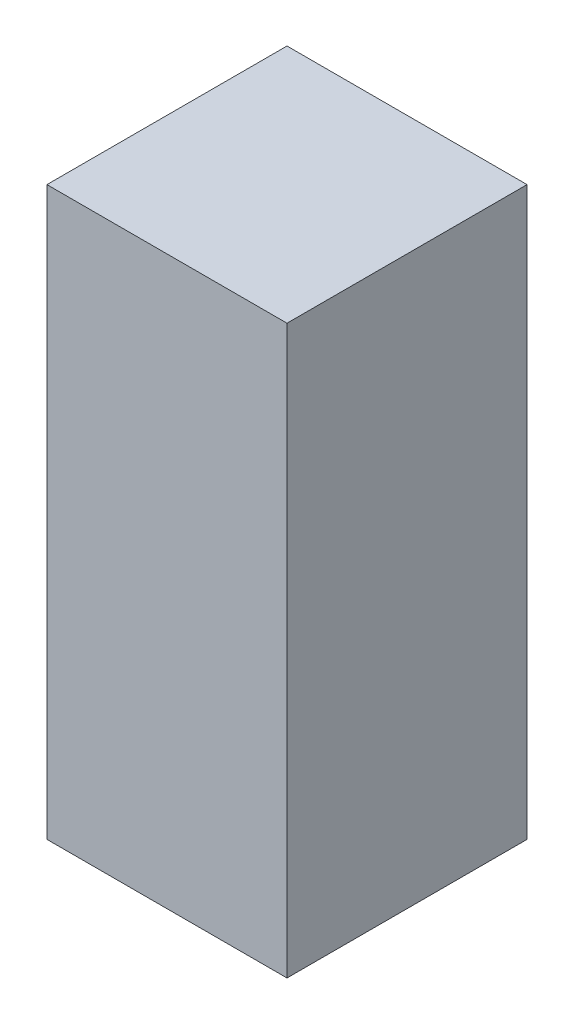
ISO-10303-21;
HEADER;
FILE_DESCRIPTION(('STEP AP214'),'2;1');
FILE_NAME('part.step','',(''),(''),'','','');
FILE_SCHEMA(('AUTOMOTIVE_DESIGN { 1 0 10303 214 1 1 1 1 }'));
ENDSEC;
DATA;
#1=APPLICATION_CONTEXT('core data for automotive mechanical design processes');
#2=APPLICATION_PROTOCOL_DEFINITION('international standard','automotive_design',2000,#1);
#3=PRODUCT_CONTEXT('',#1,'mechanical');
#4=PRODUCT('Part','Part','',(#3));
#5=PRODUCT_RELATED_PRODUCT_CATEGORY('part','',(#4));
#6=PRODUCT_DEFINITION_FORMATION('','',#4);
#7=PRODUCT_DEFINITION_CONTEXT('part definition',#1,'design');
#8=PRODUCT_DEFINITION('design','',#6,#7);
#9=PRODUCT_DEFINITION_SHAPE('','',#8);
#10=(LENGTH_UNIT() NAMED_UNIT(*) SI_UNIT(.MILLI.,.METRE.));
#11=(NAMED_UNIT(*) PLANE_ANGLE_UNIT() SI_UNIT($,.RADIAN.));
#12=(NAMED_UNIT(*) SI_UNIT($,.STERADIAN.) SOLID_ANGLE_UNIT());
#13=UNCERTAINTY_MEASURE_WITH_UNIT(LENGTH_MEASURE(1.E-05),#10,'distance_accuracy_value','');
#14=(GEOMETRIC_REPRESENTATION_CONTEXT(3) GLOBAL_UNCERTAINTY_ASSIGNED_CONTEXT((#13)) GLOBAL_UNIT_ASSIGNED_CONTEXT((#10,
#11,#12)) REPRESENTATION_CONTEXT('',''));
#15=CARTESIAN_POINT('',(0.,0.,0.));
#16=DIRECTION('',(0.,0.,1.));
#17=DIRECTION('',(1.,0.,0.));
#18=AXIS2_PLACEMENT_3D('',#15,#16,#17);
#19=CARTESIAN_POINT('',(381.,-1600.,381.));
#20=DIRECTION('',(1.,0.,0.));
#21=DIRECTION('',(0.,0.,-1.));
#22=AXIS2_PLACEMENT_3D('',#19,#20,#21);
#23=PLANE('',#22);
#24=DIRECTION('',(0.,1.,0.));
#25=VECTOR('',#24,1.);
#26=CARTESIAN_POINT('',(381.,-1600.,-381.));
#27=LINE('',#26,#25);
#28=CARTESIAN_POINT('',(381.,-1600.,-381.));
#29=VERTEX_POINT('',#28);
#30=CARTESIAN_POINT('',(381.,200.,-381.));
#31=VERTEX_POINT('',#30);
#32=EDGE_CURVE('E45',#29,#31,#27,.T.);
#33=ORIENTED_EDGE('',*,*,#32,.T.);
#34=DIRECTION('',(0.,0.,-1.));
#35=VECTOR('',#34,1.);
#36=CARTESIAN_POINT('',(381.,200.,381.));
#37=LINE('',#36,#35);
#38=CARTESIAN_POINT('',(381.,200.,381.));
#39=VERTEX_POINT('',#38);
#40=EDGE_CURVE('E83',#39,#31,#37,.T.);
#41=ORIENTED_EDGE('',*,*,#40,.F.);
#42=DIRECTION('',(0.,1.,0.));
#43=VECTOR('',#42,1.);
#44=CARTESIAN_POINT('',(381.,-1600.,381.));
#45=LINE('',#44,#43);
#46=CARTESIAN_POINT('',(381.,-1600.,381.));
#47=VERTEX_POINT('',#46);
#48=EDGE_CURVE('E11',#47,#39,#45,.T.);
#49=ORIENTED_EDGE('',*,*,#48,.F.);
#50=DIRECTION('',(0.,0.,-1.));
#51=VECTOR('',#50,1.);
#52=CARTESIAN_POINT('',(381.,-1600.,381.));
#53=LINE('',#52,#51);
#54=EDGE_CURVE('E84',#47,#29,#53,.T.);
#55=ORIENTED_EDGE('',*,*,#54,.T.);
#56=EDGE_LOOP('',(#33,#41,#49,#55));
#57=FACE_BOUND('',#56,.T.);
#58=ADVANCED_FACE('F42',(#57),#23,.T.);
#59=CARTESIAN_POINT('',(-381.,-1600.,381.));
#60=DIRECTION('',(0.,0.,1.));
#61=DIRECTION('',(1.,0.,0.));
#62=AXIS2_PLACEMENT_3D('',#59,#60,#61);
#63=PLANE('',#62);
#64=ORIENTED_EDGE('',*,*,#48,.T.);
#65=DIRECTION('',(1.,0.,0.));
#66=VECTOR('',#65,1.);
#67=CARTESIAN_POINT('',(-381.,200.,381.));
#68=LINE('',#67,#66);
#69=CARTESIAN_POINT('',(-381.,200.,381.));
#70=VERTEX_POINT('',#69);
#71=EDGE_CURVE('E102',#70,#39,#68,.T.);
#72=ORIENTED_EDGE('',*,*,#71,.F.);
#73=DIRECTION('',(0.,1.,0.));
#74=VECTOR('',#73,1.);
#75=CARTESIAN_POINT('',(-381.,-1600.,381.));
#76=LINE('',#75,#74);
#77=CARTESIAN_POINT('',(-381.,-1600.,381.));
#78=VERTEX_POINT('',#77);
#79=EDGE_CURVE('E51',#78,#70,#76,.T.);
#80=ORIENTED_EDGE('',*,*,#79,.F.);
#81=DIRECTION('',(1.,0.,0.));
#82=VECTOR('',#81,1.);
#83=CARTESIAN_POINT('',(-381.,-1600.,381.));
#84=LINE('',#83,#82);
#85=EDGE_CURVE('E90',#78,#47,#84,.T.);
#86=ORIENTED_EDGE('',*,*,#85,.T.);
#87=EDGE_LOOP('',(#64,#72,#80,#86));
#88=FACE_BOUND('',#87,.T.);
#89=ADVANCED_FACE('F156',(#88),#63,.T.);
#90=CARTESIAN_POINT('',(-381.,-1600.,381.));
#91=DIRECTION('',(-1.,0.,0.));
#92=DIRECTION('',(0.,0.,1.));
#93=AXIS2_PLACEMENT_3D('',#90,#91,#92);
#94=PLANE('',#93);
#95=ORIENTED_EDGE('',*,*,#79,.T.);
#96=DIRECTION('',(0.,0.,1.));
#97=VECTOR('',#96,1.);
#98=CARTESIAN_POINT('',(-381.,200.,381.));
#99=LINE('',#98,#97);
#100=CARTESIAN_POINT('',(-381.,200.,-381.));
#101=VERTEX_POINT('',#100);
#102=EDGE_CURVE('E98',#101,#70,#99,.T.);
#103=ORIENTED_EDGE('',*,*,#102,.F.);
#104=DIRECTION('',(0.,1.,0.));
#105=VECTOR('',#104,1.);
#106=CARTESIAN_POINT('',(-381.,-1600.,-381.));
#107=LINE('',#106,#105);
#108=CARTESIAN_POINT('',(-381.,-1600.,-381.));
#109=VERTEX_POINT('',#108);
#110=EDGE_CURVE('E89',#109,#101,#107,.T.);
#111=ORIENTED_EDGE('',*,*,#110,.F.);
#112=DIRECTION('',(0.,0.,1.));
#113=VECTOR('',#112,1.);
#114=CARTESIAN_POINT('',(-381.,-1600.,381.));
#115=LINE('',#114,#113);
#116=EDGE_CURVE('E123',#109,#78,#115,.T.);
#117=ORIENTED_EDGE('',*,*,#116,.T.);
#118=EDGE_LOOP('',(#95,#103,#111,#117));
#119=FACE_BOUND('',#118,.T.);
#120=ADVANCED_FACE('F159',(#119),#94,.T.);
#121=CARTESIAN_POINT('',(-381.,-1600.,-381.));
#122=DIRECTION('',(0.,0.,-1.));
#123=DIRECTION('',(-1.,0.,0.));
#124=AXIS2_PLACEMENT_3D('',#121,#122,#123);
#125=PLANE('',#124);
#126=ORIENTED_EDGE('',*,*,#110,.T.);
#127=DIRECTION('',(-1.,0.,0.));
#128=VECTOR('',#127,1.);
#129=CARTESIAN_POINT('',(-381.,200.,-381.));
#130=LINE('',#129,#128);
#131=EDGE_CURVE('E92',#31,#101,#130,.T.);
#132=ORIENTED_EDGE('',*,*,#131,.F.);
#133=ORIENTED_EDGE('',*,*,#32,.F.);
#134=DIRECTION('',(-1.,0.,0.));
#135=VECTOR('',#134,1.);
#136=CARTESIAN_POINT('',(-381.,-1600.,-381.));
#137=LINE('',#136,#135);
#138=EDGE_CURVE('E120',#29,#109,#137,.T.);
#139=ORIENTED_EDGE('',*,*,#138,.T.);
#140=EDGE_LOOP('',(#126,#132,#133,#139));
#141=FACE_BOUND('',#140,.T.);
#142=ADVANCED_FACE('F93',(#141),#125,.T.);
#143=CARTESIAN_POINT('',(0.,-1600.,0.));
#144=DIRECTION('',(0.,-1.,0.));
#145=DIRECTION('',(0.,0.,-1.));
#146=AXIS2_PLACEMENT_3D('',#143,#144,#145);
#147=PLANE('',#146);
#148=ORIENTED_EDGE('',*,*,#54,.F.);
#149=ORIENTED_EDGE('',*,*,#85,.F.);
#150=ORIENTED_EDGE('',*,*,#116,.F.);
#151=ORIENTED_EDGE('',*,*,#138,.F.);
#152=EDGE_LOOP('',(#148,#149,#150,#151));
#153=FACE_BOUND('',#152,.T.);
#154=ADVANCED_FACE('F152',(#153),#147,.T.);
#155=CARTESIAN_POINT('',(0.,200.,0.));
#156=DIRECTION('',(0.,-1.,0.));
#157=DIRECTION('',(0.,0.,-1.));
#158=AXIS2_PLACEMENT_3D('',#155,#156,#157);
#159=PLANE('',#158);
#160=ORIENTED_EDGE('',*,*,#40,.T.);
#161=ORIENTED_EDGE('',*,*,#131,.T.);
#162=ORIENTED_EDGE('',*,*,#102,.T.);
#163=ORIENTED_EDGE('',*,*,#71,.T.);
#164=EDGE_LOOP('',(#160,#161,#162,#163));
#165=FACE_BOUND('',#164,.T.);
#166=ADVANCED_FACE('F101',(#165),#159,.F.);
#167=CLOSED_SHELL('',(#58,#89,#120,#142,#154,#166));
#168=CARTESIAN_POINT('',(0.,-1500.,0.));
#169=DIRECTION('',(0.,1.,0.));
#170=DIRECTION('',(0.,0.,1.));
#171=AXIS2_PLACEMENT_3D('',#168,#169,#170);
#172=CYLINDRICAL_SURFACE('',#171,304.8);
#173=CARTESIAN_POINT('',(0.,-1500.,0.));
#174=DIRECTION('',(0.,1.,0.));
#175=DIRECTION('',(0.,0.,1.));
#176=AXIS2_PLACEMENT_3D('',#173,#174,#175);
#177=CIRCLE('',#176,304.8);
#178=CARTESIAN_POINT('',(0.,-1500.,304.8));
#179=VERTEX_POINT('',#178);
#180=EDGE_CURVE('E104',#179,#179,#177,.T.);
#181=ORIENTED_EDGE('',*,*,#180,.F.);
#182=EDGE_LOOP('',(#181));
#183=FACE_BOUND('',#182,.T.);
#184=CARTESIAN_POINT('',(0.,100.,0.));
#185=DIRECTION('',(0.,1.,0.));
#186=DIRECTION('',(0.,0.,1.));
#187=AXIS2_PLACEMENT_3D('',#184,#185,#186);
#188=CIRCLE('',#187,304.8);
#189=CARTESIAN_POINT('',(0.,100.,304.8));
#190=VERTEX_POINT('',#189);
#191=EDGE_CURVE('E110',#190,#190,#188,.T.);
#192=ORIENTED_EDGE('',*,*,#191,.T.);
#193=EDGE_LOOP('',(#192));
#194=FACE_BOUND('',#193,.T.);
#195=ADVANCED_FACE('F132',(#183,#194),#172,.F.);
#196=CARTESIAN_POINT('',(0.,-1500.,0.));
#197=DIRECTION('',(0.,1.,0.));
#198=DIRECTION('',(0.,0.,1.));
#199=AXIS2_PLACEMENT_3D('',#196,#197,#198);
#200=PLANE('',#199);
#201=ORIENTED_EDGE('',*,*,#180,.T.);
#202=EDGE_LOOP('',(#201));
#203=FACE_BOUND('',#202,.T.);
#204=ADVANCED_FACE('F136',(#203),#200,.T.);
#205=CARTESIAN_POINT('',(0.,100.,0.));
#206=DIRECTION('',(0.,1.,0.));
#207=DIRECTION('',(0.,0.,1.));
#208=AXIS2_PLACEMENT_3D('',#205,#206,#207);
#209=PLANE('',#208);
#210=ORIENTED_EDGE('',*,*,#191,.F.);
#211=EDGE_LOOP('',(#210));
#212=FACE_BOUND('',#211,.T.);
#213=ADVANCED_FACE('F134',(#212),#209,.F.);
#214=CLOSED_SHELL('',(#195,#204,#213));
#215=ORIENTED_CLOSED_SHELL('',*,#214,.T.);
#216=BREP_WITH_VOIDS('B2',#167,(#215));
#217=ADVANCED_BREP_SHAPE_REPRESENTATION('',(#18,#216),#14);
#218=SHAPE_DEFINITION_REPRESENTATION(#9,#217);
ENDSEC;
END-ISO-10303-21;
